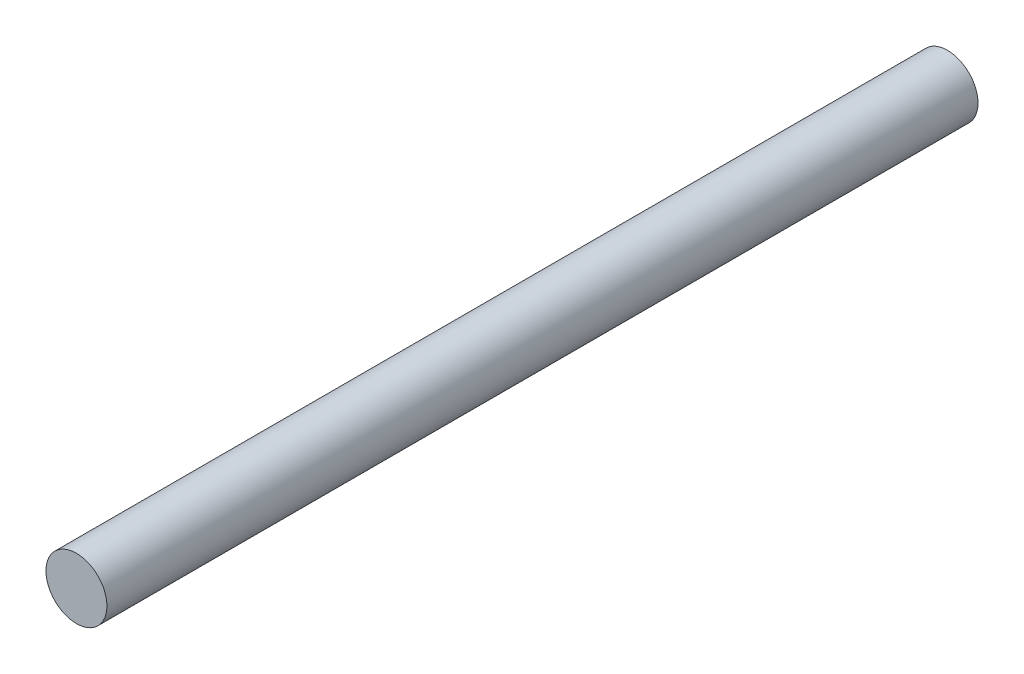
ISO-10303-21;
HEADER;
FILE_DESCRIPTION(('STEP AP214'),'2;1');
FILE_NAME('part.step','',(''),(''),'','','');
FILE_SCHEMA(('AUTOMOTIVE_DESIGN { 1 0 10303 214 1 1 1 1 }'));
ENDSEC;
DATA;
#1=APPLICATION_CONTEXT('core data for automotive mechanical design processes');
#2=APPLICATION_PROTOCOL_DEFINITION('international standard','automotive_design',2000,#1);
#3=PRODUCT_CONTEXT('',#1,'mechanical');
#4=PRODUCT('Part','Part','',(#3));
#5=PRODUCT_RELATED_PRODUCT_CATEGORY('part','',(#4));
#6=PRODUCT_DEFINITION_FORMATION('','',#4);
#7=PRODUCT_DEFINITION_CONTEXT('part definition',#1,'design');
#8=PRODUCT_DEFINITION('design','',#6,#7);
#9=PRODUCT_DEFINITION_SHAPE('','',#8);
#10=(LENGTH_UNIT() NAMED_UNIT(*) SI_UNIT(.MILLI.,.METRE.));
#11=(NAMED_UNIT(*) PLANE_ANGLE_UNIT() SI_UNIT($,.RADIAN.));
#12=(NAMED_UNIT(*) SI_UNIT($,.STERADIAN.) SOLID_ANGLE_UNIT());
#13=UNCERTAINTY_MEASURE_WITH_UNIT(LENGTH_MEASURE(1.E-05),#10,'distance_accuracy_value','');
#14=(GEOMETRIC_REPRESENTATION_CONTEXT(3) GLOBAL_UNCERTAINTY_ASSIGNED_CONTEXT((#13)) GLOBAL_UNIT_ASSIGNED_CONTEXT((#10,
#11,#12)) REPRESENTATION_CONTEXT('',''));
#15=CARTESIAN_POINT('',(0.,0.,0.));
#16=DIRECTION('',(0.,0.,1.));
#17=DIRECTION('',(1.,0.,0.));
#18=AXIS2_PLACEMENT_3D('',#15,#16,#17);
#19=CARTESIAN_POINT('',(0.,0.,279.4));
#20=DIRECTION('',(0.,0.,-1.));
#21=DIRECTION('',(-1.,0.,0.));
#22=AXIS2_PLACEMENT_3D('',#19,#20,#21);
#23=CYLINDRICAL_SURFACE('',#22,9.779);
#24=CARTESIAN_POINT('',(0.,0.,279.4));
#25=DIRECTION('',(0.,0.,1.));
#26=DIRECTION('',(1.,0.,0.));
#27=AXIS2_PLACEMENT_3D('',#24,#25,#26);
#28=CIRCLE('',#27,9.779);
#29=CARTESIAN_POINT('',(9.779,0.,279.4));
#30=VERTEX_POINT('',#29);
#31=EDGE_CURVE('E10',#30,#30,#28,.T.);
#32=ORIENTED_EDGE('',*,*,#31,.F.);
#33=EDGE_LOOP('',(#32));
#34=FACE_BOUND('',#33,.T.);
#35=CARTESIAN_POINT('',(0.,0.,0.));
#36=DIRECTION('',(0.,0.,1.));
#37=DIRECTION('',(1.,0.,0.));
#38=AXIS2_PLACEMENT_3D('',#35,#36,#37);
#39=CIRCLE('',#38,9.779);
#40=CARTESIAN_POINT('',(9.779,0.,0.));
#41=VERTEX_POINT('',#40);
#42=EDGE_CURVE('E34',#41,#41,#39,.T.);
#43=ORIENTED_EDGE('',*,*,#42,.T.);
#44=EDGE_LOOP('',(#43));
#45=FACE_BOUND('',#44,.T.);
#46=ADVANCED_FACE('F31',(#34,#45),#23,.T.);
#47=CARTESIAN_POINT('',(0.,0.,279.4));
#48=DIRECTION('',(0.,0.,1.));
#49=DIRECTION('',(1.,0.,0.));
#50=AXIS2_PLACEMENT_3D('',#47,#48,#49);
#51=PLANE('',#50);
#52=ORIENTED_EDGE('',*,*,#31,.T.);
#53=EDGE_LOOP('',(#52));
#54=FACE_BOUND('',#53,.T.);
#55=ADVANCED_FACE('F46',(#54),#51,.T.);
#56=CARTESIAN_POINT('',(0.,0.,0.));
#57=DIRECTION('',(0.,0.,1.));
#58=DIRECTION('',(1.,0.,0.));
#59=AXIS2_PLACEMENT_3D('',#56,#57,#58);
#60=PLANE('',#59);
#61=ORIENTED_EDGE('',*,*,#42,.F.);
#62=EDGE_LOOP('',(#61));
#63=FACE_BOUND('',#62,.T.);
#64=ADVANCED_FACE('F44',(#63),#60,.F.);
#65=CLOSED_SHELL('',(#46,#55,#64));
#66=MANIFOLD_SOLID_BREP('B2',#65);
#67=ADVANCED_BREP_SHAPE_REPRESENTATION('',(#18,#66),#14);
#68=SHAPE_DEFINITION_REPRESENTATION(#9,#67);
ENDSEC;
END-ISO-10303-21;
